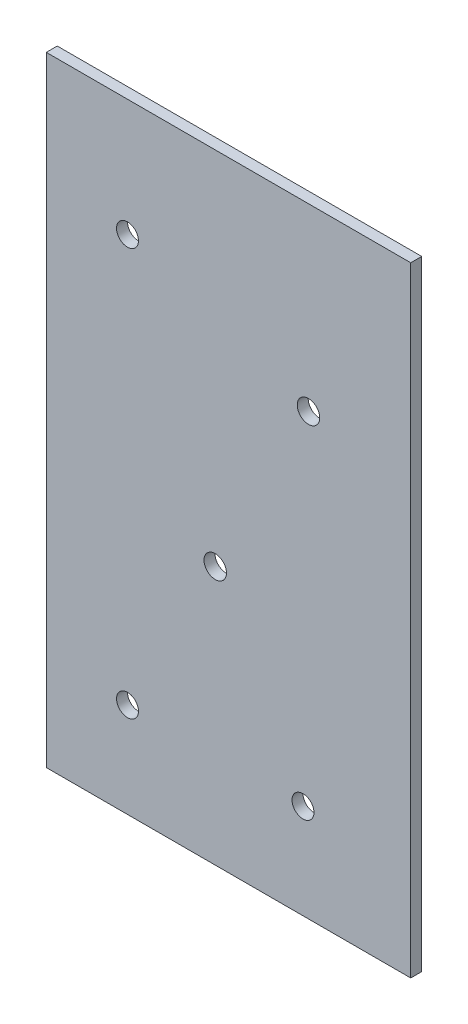
ISO-10303-21;
HEADER;
FILE_DESCRIPTION(('STEP AP214'),'2;1');
FILE_NAME('part.step','',(''),(''),'','','');
FILE_SCHEMA(('AUTOMOTIVE_DESIGN { 1 0 10303 214 1 1 1 1 }'));
ENDSEC;
DATA;
#1=APPLICATION_CONTEXT('core data for automotive mechanical design processes');
#2=APPLICATION_PROTOCOL_DEFINITION('international standard','automotive_design',2000,#1);
#3=PRODUCT_CONTEXT('',#1,'mechanical');
#4=PRODUCT('Part','Part','',(#3));
#5=PRODUCT_RELATED_PRODUCT_CATEGORY('part','',(#4));
#6=PRODUCT_DEFINITION_FORMATION('','',#4);
#7=PRODUCT_DEFINITION_CONTEXT('part definition',#1,'design');
#8=PRODUCT_DEFINITION('design','',#6,#7);
#9=PRODUCT_DEFINITION_SHAPE('','',#8);
#10=(LENGTH_UNIT() NAMED_UNIT(*) SI_UNIT(.MILLI.,.METRE.));
#11=(NAMED_UNIT(*) PLANE_ANGLE_UNIT() SI_UNIT($,.RADIAN.));
#12=(NAMED_UNIT(*) SI_UNIT($,.STERADIAN.) SOLID_ANGLE_UNIT());
#13=UNCERTAINTY_MEASURE_WITH_UNIT(LENGTH_MEASURE(1.E-05),#10,'distance_accuracy_value','');
#14=(GEOMETRIC_REPRESENTATION_CONTEXT(3) GLOBAL_UNCERTAINTY_ASSIGNED_CONTEXT((#13)) GLOBAL_UNIT_ASSIGNED_CONTEXT((#10,
#11,#12)) REPRESENTATION_CONTEXT('',''));
#15=CARTESIAN_POINT('',(0.,0.,0.));
#16=DIRECTION('',(0.,0.,1.));
#17=DIRECTION('',(1.,0.,0.));
#18=AXIS2_PLACEMENT_3D('',#15,#16,#17);
#19=CARTESIAN_POINT('',(0.,0.,3.175));
#20=DIRECTION('',(0.,0.,1.));
#21=DIRECTION('',(1.,0.,0.));
#22=AXIS2_PLACEMENT_3D('',#19,#20,#21);
#23=PLANE('',#22);
#24=CARTESIAN_POINT('',(77.7874999999999,158.75,3.175));
#25=DIRECTION('',(0.,0.,1.));
#26=DIRECTION('',(1.,0.,0.));
#27=AXIS2_PLACEMENT_3D('',#24,#25,#26);
#28=CIRCLE('',#27,3.25119999999999);
#29=CARTESIAN_POINT('',(81.0386999999999,158.75,3.175));
#30=VERTEX_POINT('',#29);
#31=EDGE_CURVE('E156',#30,#30,#28,.T.);
#32=ORIENTED_EDGE('',*,*,#31,.F.);
#33=EDGE_LOOP('',(#32));
#34=FACE_BOUND('',#33,.T.);
#35=CARTESIAN_POINT('',(76.1999999999998,58.9642857142862,3.175));
#36=DIRECTION('',(0.,0.,1.));
#37=DIRECTION('',(1.,0.,0.));
#38=AXIS2_PLACEMENT_3D('',#35,#36,#37);
#39=CIRCLE('',#38,3.175);
#40=CARTESIAN_POINT('',(79.3749999999998,58.9642857142862,3.175));
#41=VERTEX_POINT('',#40);
#42=EDGE_CURVE('E140',#41,#41,#39,.T.);
#43=ORIENTED_EDGE('',*,*,#42,.F.);
#44=EDGE_LOOP('',(#43));
#45=FACE_BOUND('',#44,.T.);
#46=DIRECTION('',(0.,-1.,0.));
#47=VECTOR('',#46,1.);
#48=CARTESIAN_POINT('',(1.88908690790865,210.816126932571,3.175));
#49=LINE('',#48,#47);
#50=CARTESIAN_POINT('',(1.88908690790865,210.816126932571,3.175));
#51=VERTEX_POINT('',#50);
#52=CARTESIAN_POINT('',(1.88908690790868,31.517256692789,3.175));
#53=VERTEX_POINT('',#52);
#54=EDGE_CURVE('E98',#51,#53,#49,.T.);
#55=ORIENTED_EDGE('',*,*,#54,.T.);
#56=DIRECTION('',(1.,0.,0.));
#57=VECTOR('',#56,1.);
#58=CARTESIAN_POINT('',(1.88908690790868,31.517256692789,3.175));
#59=LINE('',#58,#57);
#60=CARTESIAN_POINT('',(107.38691409108,31.517256692789,3.175));
#61=VERTEX_POINT('',#60);
#62=EDGE_CURVE('E93',#53,#61,#59,.T.);
#63=ORIENTED_EDGE('',*,*,#62,.T.);
#64=DIRECTION('',(0.,1.,0.));
#65=VECTOR('',#64,1.);
#66=CARTESIAN_POINT('',(107.38691409108,210.816126932571,3.175));
#67=LINE('',#66,#65);
#68=CARTESIAN_POINT('',(107.38691409108,210.816126932571,3.175));
#69=VERTEX_POINT('',#68);
#70=EDGE_CURVE('E96',#61,#69,#67,.T.);
#71=ORIENTED_EDGE('',*,*,#70,.T.);
#72=DIRECTION('',(-1.,0.,0.));
#73=VECTOR('',#72,1.);
#74=CARTESIAN_POINT('',(1.88908690790865,210.816126932571,3.175));
#75=LINE('',#74,#73);
#76=EDGE_CURVE('E63',#69,#51,#75,.T.);
#77=ORIENTED_EDGE('',*,*,#76,.T.);
#78=EDGE_LOOP('',(#55,#63,#71,#77));
#79=FACE_BOUND('',#78,.T.);
#80=CARTESIAN_POINT('',(25.3999999999998,58.9642857142856,3.175));
#81=DIRECTION('',(0.,0.,1.));
#82=DIRECTION('',(1.,0.,0.));
#83=AXIS2_PLACEMENT_3D('',#80,#81,#82);
#84=CIRCLE('',#83,3.175);
#85=CARTESIAN_POINT('',(28.5749999999998,58.9642857142856,3.175));
#86=VERTEX_POINT('',#85);
#87=EDGE_CURVE('E118',#86,#86,#84,.T.);
#88=ORIENTED_EDGE('',*,*,#87,.F.);
#89=EDGE_LOOP('',(#88));
#90=FACE_BOUND('',#89,.T.);
#91=CARTESIAN_POINT('',(25.3999999999994,176.892857142857,3.175));
#92=DIRECTION('',(0.,0.,1.));
#93=DIRECTION('',(1.,0.,0.));
#94=AXIS2_PLACEMENT_3D('',#91,#92,#93);
#95=CIRCLE('',#94,3.17500000000001);
#96=CARTESIAN_POINT('',(28.5749999999994,176.892857142857,3.175));
#97=VERTEX_POINT('',#96);
#98=EDGE_CURVE('E148',#97,#97,#95,.T.);
#99=ORIENTED_EDGE('',*,*,#98,.F.);
#100=EDGE_LOOP('',(#99));
#101=FACE_BOUND('',#100,.T.);
#102=CARTESIAN_POINT('',(50.7999999999999,106.3625,3.175));
#103=DIRECTION('',(0.,0.,1.));
#104=DIRECTION('',(1.,0.,0.));
#105=AXIS2_PLACEMENT_3D('',#102,#103,#104);
#106=CIRCLE('',#105,3.25119999999999);
#107=CARTESIAN_POINT('',(54.0511999999999,106.3625,3.175));
#108=VERTEX_POINT('',#107);
#109=EDGE_CURVE('E164',#108,#108,#106,.T.);
#110=ORIENTED_EDGE('',*,*,#109,.F.);
#111=EDGE_LOOP('',(#110));
#112=FACE_BOUND('',#111,.T.);
#113=ADVANCED_FACE('F45',(#34,#45,#79,#90,#101,#112),#23,.T.);
#114=CARTESIAN_POINT('',(0.,0.,0.));
#115=DIRECTION('',(0.,0.,1.));
#116=DIRECTION('',(1.,0.,0.));
#117=AXIS2_PLACEMENT_3D('',#114,#115,#116);
#118=PLANE('',#117);
#119=DIRECTION('',(0.,-1.,0.));
#120=VECTOR('',#119,1.);
#121=CARTESIAN_POINT('',(1.88908690790865,210.816126932571,0.));
#122=LINE('',#121,#120);
#123=CARTESIAN_POINT('',(1.88908690790865,210.816126932571,0.));
#124=VERTEX_POINT('',#123);
#125=CARTESIAN_POINT('',(1.88908690790868,31.517256692789,0.));
#126=VERTEX_POINT('',#125);
#127=EDGE_CURVE('E114',#124,#126,#122,.T.);
#128=ORIENTED_EDGE('',*,*,#127,.F.);
#129=DIRECTION('',(-1.,0.,0.));
#130=VECTOR('',#129,1.);
#131=CARTESIAN_POINT('',(1.88908690790865,210.816126932571,0.));
#132=LINE('',#131,#130);
#133=CARTESIAN_POINT('',(107.38691409108,210.816126932571,0.));
#134=VERTEX_POINT('',#133);
#135=EDGE_CURVE('E86',#134,#124,#132,.T.);
#136=ORIENTED_EDGE('',*,*,#135,.F.);
#137=DIRECTION('',(0.,1.,0.));
#138=VECTOR('',#137,1.);
#139=CARTESIAN_POINT('',(107.38691409108,210.816126932571,0.));
#140=LINE('',#139,#138);
#141=CARTESIAN_POINT('',(107.38691409108,31.517256692789,0.));
#142=VERTEX_POINT('',#141);
#143=EDGE_CURVE('E80',#142,#134,#140,.T.);
#144=ORIENTED_EDGE('',*,*,#143,.F.);
#145=DIRECTION('',(1.,0.,0.));
#146=VECTOR('',#145,1.);
#147=CARTESIAN_POINT('',(1.88908690790868,31.517256692789,0.));
#148=LINE('',#147,#146);
#149=EDGE_CURVE('E103',#126,#142,#148,.T.);
#150=ORIENTED_EDGE('',*,*,#149,.F.);
#151=EDGE_LOOP('',(#128,#136,#144,#150));
#152=FACE_BOUND('',#151,.T.);
#153=CARTESIAN_POINT('',(25.3999999999998,58.9642857142856,0.));
#154=DIRECTION('',(0.,0.,1.));
#155=DIRECTION('',(1.,0.,0.));
#156=AXIS2_PLACEMENT_3D('',#153,#154,#155);
#157=CIRCLE('',#156,3.175);
#158=CARTESIAN_POINT('',(28.5749999999998,58.9642857142856,0.));
#159=VERTEX_POINT('',#158);
#160=EDGE_CURVE('E136',#159,#159,#157,.T.);
#161=ORIENTED_EDGE('',*,*,#160,.T.);
#162=EDGE_LOOP('',(#161));
#163=FACE_BOUND('',#162,.T.);
#164=CARTESIAN_POINT('',(76.1999999999998,58.9642857142862,0.));
#165=DIRECTION('',(0.,0.,1.));
#166=DIRECTION('',(1.,0.,0.));
#167=AXIS2_PLACEMENT_3D('',#164,#165,#166);
#168=CIRCLE('',#167,3.175);
#169=CARTESIAN_POINT('',(79.3749999999998,58.9642857142862,0.));
#170=VERTEX_POINT('',#169);
#171=EDGE_CURVE('E144',#170,#170,#168,.T.);
#172=ORIENTED_EDGE('',*,*,#171,.T.);
#173=EDGE_LOOP('',(#172));
#174=FACE_BOUND('',#173,.T.);
#175=CARTESIAN_POINT('',(25.3999999999994,176.892857142857,0.));
#176=DIRECTION('',(0.,0.,1.));
#177=DIRECTION('',(1.,0.,0.));
#178=AXIS2_PLACEMENT_3D('',#175,#176,#177);
#179=CIRCLE('',#178,3.17500000000001);
#180=CARTESIAN_POINT('',(28.5749999999994,176.892857142857,0.));
#181=VERTEX_POINT('',#180);
#182=EDGE_CURVE('E152',#181,#181,#179,.T.);
#183=ORIENTED_EDGE('',*,*,#182,.T.);
#184=EDGE_LOOP('',(#183));
#185=FACE_BOUND('',#184,.T.);
#186=CARTESIAN_POINT('',(77.7874999999999,158.75,0.));
#187=DIRECTION('',(0.,0.,1.));
#188=DIRECTION('',(1.,0.,0.));
#189=AXIS2_PLACEMENT_3D('',#186,#187,#188);
#190=CIRCLE('',#189,3.25119999999999);
#191=CARTESIAN_POINT('',(81.0386999999999,158.75,0.));
#192=VERTEX_POINT('',#191);
#193=EDGE_CURVE('E160',#192,#192,#190,.T.);
#194=ORIENTED_EDGE('',*,*,#193,.T.);
#195=EDGE_LOOP('',(#194));
#196=FACE_BOUND('',#195,.T.);
#197=CARTESIAN_POINT('',(50.7999999999999,106.3625,0.));
#198=DIRECTION('',(0.,0.,1.));
#199=DIRECTION('',(1.,0.,0.));
#200=AXIS2_PLACEMENT_3D('',#197,#198,#199);
#201=CIRCLE('',#200,3.25119999999999);
#202=CARTESIAN_POINT('',(54.0511999999999,106.3625,0.));
#203=VERTEX_POINT('',#202);
#204=EDGE_CURVE('E168',#203,#203,#201,.T.);
#205=ORIENTED_EDGE('',*,*,#204,.T.);
#206=EDGE_LOOP('',(#205));
#207=FACE_BOUND('',#206,.T.);
#208=ADVANCED_FACE('F131',(#152,#163,#174,#185,#196,#207),#118,.F.);
#209=CARTESIAN_POINT('',(1.88908690790865,210.816126932571,3.175));
#210=DIRECTION('',(1.,0.,0.));
#211=DIRECTION('',(0.,1.,0.));
#212=AXIS2_PLACEMENT_3D('',#209,#210,#211);
#213=PLANE('',#212);
#214=ORIENTED_EDGE('',*,*,#127,.T.);
#215=DIRECTION('',(0.,0.,-1.));
#216=VECTOR('',#215,1.);
#217=CARTESIAN_POINT('',(1.88908690790868,31.517256692789,3.175));
#218=LINE('',#217,#216);
#219=EDGE_CURVE('E11',#53,#126,#218,.T.);
#220=ORIENTED_EDGE('',*,*,#219,.F.);
#221=ORIENTED_EDGE('',*,*,#54,.F.);
#222=DIRECTION('',(0.,0.,-1.));
#223=VECTOR('',#222,1.);
#224=CARTESIAN_POINT('',(1.88908690790865,210.816126932571,3.175));
#225=LINE('',#224,#223);
#226=EDGE_CURVE('E110',#51,#124,#225,.T.);
#227=ORIENTED_EDGE('',*,*,#226,.T.);
#228=EDGE_LOOP('',(#214,#220,#221,#227));
#229=FACE_BOUND('',#228,.T.);
#230=ADVANCED_FACE('F47',(#229),#213,.F.);
#231=CARTESIAN_POINT('',(1.88908690790868,31.517256692789,3.175));
#232=DIRECTION('',(0.,1.,0.));
#233=DIRECTION('',(0.,0.,1.));
#234=AXIS2_PLACEMENT_3D('',#231,#232,#233);
#235=PLANE('',#234);
#236=ORIENTED_EDGE('',*,*,#149,.T.);
#237=DIRECTION('',(0.,0.,-1.));
#238=VECTOR('',#237,1.);
#239=CARTESIAN_POINT('',(107.38691409108,31.517256692789,3.175));
#240=LINE('',#239,#238);
#241=EDGE_CURVE('E55',#61,#142,#240,.T.);
#242=ORIENTED_EDGE('',*,*,#241,.F.);
#243=ORIENTED_EDGE('',*,*,#62,.F.);
#244=ORIENTED_EDGE('',*,*,#219,.T.);
#245=EDGE_LOOP('',(#236,#242,#243,#244));
#246=FACE_BOUND('',#245,.T.);
#247=ADVANCED_FACE('F102',(#246),#235,.F.);
#248=CARTESIAN_POINT('',(107.38691409108,210.816126932571,3.175));
#249=DIRECTION('',(-1.,0.,0.));
#250=DIRECTION('',(0.,0.,1.));
#251=AXIS2_PLACEMENT_3D('',#248,#249,#250);
#252=PLANE('',#251);
#253=ORIENTED_EDGE('',*,*,#143,.T.);
#254=DIRECTION('',(0.,0.,-1.));
#255=VECTOR('',#254,1.);
#256=CARTESIAN_POINT('',(107.38691409108,210.816126932571,3.175));
#257=LINE('',#256,#255);
#258=EDGE_CURVE('E105',#69,#134,#257,.T.);
#259=ORIENTED_EDGE('',*,*,#258,.F.);
#260=ORIENTED_EDGE('',*,*,#70,.F.);
#261=ORIENTED_EDGE('',*,*,#241,.T.);
#262=EDGE_LOOP('',(#253,#259,#260,#261));
#263=FACE_BOUND('',#262,.T.);
#264=ADVANCED_FACE('F106',(#263),#252,.F.);
#265=CARTESIAN_POINT('',(1.88908690790865,210.816126932571,3.175));
#266=DIRECTION('',(0.,-1.,0.));
#267=DIRECTION('',(0.,0.,-1.));
#268=AXIS2_PLACEMENT_3D('',#265,#266,#267);
#269=PLANE('',#268);
#270=ORIENTED_EDGE('',*,*,#135,.T.);
#271=ORIENTED_EDGE('',*,*,#226,.F.);
#272=ORIENTED_EDGE('',*,*,#76,.F.);
#273=ORIENTED_EDGE('',*,*,#258,.T.);
#274=EDGE_LOOP('',(#270,#271,#272,#273));
#275=FACE_BOUND('',#274,.T.);
#276=ADVANCED_FACE('F128',(#275),#269,.F.);
#277=CARTESIAN_POINT('',(25.3999999999998,58.9642857142856,3.175));
#278=DIRECTION('',(0.,0.,-1.));
#279=DIRECTION('',(-1.,0.,0.));
#280=AXIS2_PLACEMENT_3D('',#277,#278,#279);
#281=CYLINDRICAL_SURFACE('',#280,3.175);
#282=ORIENTED_EDGE('',*,*,#87,.T.);
#283=EDGE_LOOP('',(#282));
#284=FACE_BOUND('',#283,.T.);
#285=ORIENTED_EDGE('',*,*,#160,.F.);
#286=EDGE_LOOP('',(#285));
#287=FACE_BOUND('',#286,.T.);
#288=ADVANCED_FACE('F189',(#284,#287),#281,.F.);
#289=CARTESIAN_POINT('',(76.1999999999998,58.9642857142862,3.175));
#290=DIRECTION('',(0.,0.,-1.));
#291=DIRECTION('',(-1.,0.,0.));
#292=AXIS2_PLACEMENT_3D('',#289,#290,#291);
#293=CYLINDRICAL_SURFACE('',#292,3.175);
#294=ORIENTED_EDGE('',*,*,#42,.T.);
#295=EDGE_LOOP('',(#294));
#296=FACE_BOUND('',#295,.T.);
#297=ORIENTED_EDGE('',*,*,#171,.F.);
#298=EDGE_LOOP('',(#297));
#299=FACE_BOUND('',#298,.T.);
#300=ADVANCED_FACE('F257',(#296,#299),#293,.F.);
#301=CARTESIAN_POINT('',(25.3999999999994,176.892857142857,3.175));
#302=DIRECTION('',(0.,0.,-1.));
#303=DIRECTION('',(-1.,0.,0.));
#304=AXIS2_PLACEMENT_3D('',#301,#302,#303);
#305=CYLINDRICAL_SURFACE('',#304,3.17500000000001);
#306=ORIENTED_EDGE('',*,*,#98,.T.);
#307=EDGE_LOOP('',(#306));
#308=FACE_BOUND('',#307,.T.);
#309=ORIENTED_EDGE('',*,*,#182,.F.);
#310=EDGE_LOOP('',(#309));
#311=FACE_BOUND('',#310,.T.);
#312=ADVANCED_FACE('F268',(#308,#311),#305,.F.);
#313=CARTESIAN_POINT('',(77.7874999999999,158.75,3.175));
#314=DIRECTION('',(0.,0.,-1.));
#315=DIRECTION('',(-1.,0.,0.));
#316=AXIS2_PLACEMENT_3D('',#313,#314,#315);
#317=CYLINDRICAL_SURFACE('',#316,3.25119999999999);
#318=ORIENTED_EDGE('',*,*,#31,.T.);
#319=EDGE_LOOP('',(#318));
#320=FACE_BOUND('',#319,.T.);
#321=ORIENTED_EDGE('',*,*,#193,.F.);
#322=EDGE_LOOP('',(#321));
#323=FACE_BOUND('',#322,.T.);
#324=ADVANCED_FACE('F279',(#320,#323),#317,.F.);
#325=CARTESIAN_POINT('',(50.7999999999999,106.3625,3.175));
#326=DIRECTION('',(0.,0.,-1.));
#327=DIRECTION('',(-1.,0.,0.));
#328=AXIS2_PLACEMENT_3D('',#325,#326,#327);
#329=CYLINDRICAL_SURFACE('',#328,3.25119999999999);
#330=ORIENTED_EDGE('',*,*,#109,.T.);
#331=EDGE_LOOP('',(#330));
#332=FACE_BOUND('',#331,.T.);
#333=ORIENTED_EDGE('',*,*,#204,.F.);
#334=EDGE_LOOP('',(#333));
#335=FACE_BOUND('',#334,.T.);
#336=ADVANCED_FACE('F176',(#332,#335),#329,.F.);
#337=CLOSED_SHELL('',(#113,#208,#230,#247,#264,#276,#288,#300,#312,#324,#336));
#338=MANIFOLD_SOLID_BREP('B2',#337);
#339=ADVANCED_BREP_SHAPE_REPRESENTATION('',(#18,#338),#14);
#340=SHAPE_DEFINITION_REPRESENTATION(#9,#339);
ENDSEC;
END-ISO-10303-21;
